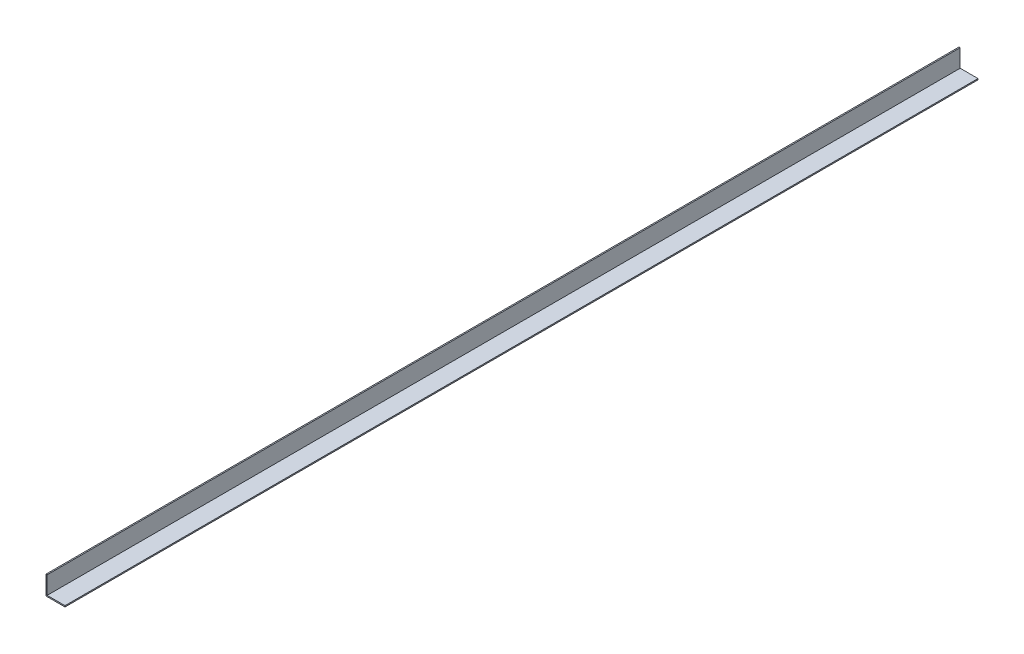
ISO-10303-21;
HEADER;
FILE_DESCRIPTION(('STEP AP214'),'2;1');
FILE_NAME('part.step','',(''),(''),'','','');
FILE_SCHEMA(('AUTOMOTIVE_DESIGN { 1 0 10303 214 1 1 1 1 }'));
ENDSEC;
DATA;
#1=APPLICATION_CONTEXT('core data for automotive mechanical design processes');
#2=APPLICATION_PROTOCOL_DEFINITION('international standard','automotive_design',2000,#1);
#3=PRODUCT_CONTEXT('',#1,'mechanical');
#4=PRODUCT('Part','Part','',(#3));
#5=PRODUCT_RELATED_PRODUCT_CATEGORY('part','',(#4));
#6=PRODUCT_DEFINITION_FORMATION('','',#4);
#7=PRODUCT_DEFINITION_CONTEXT('part definition',#1,'design');
#8=PRODUCT_DEFINITION('design','',#6,#7);
#9=PRODUCT_DEFINITION_SHAPE('','',#8);
#10=(LENGTH_UNIT() NAMED_UNIT(*) SI_UNIT(.MILLI.,.METRE.));
#11=(NAMED_UNIT(*) PLANE_ANGLE_UNIT() SI_UNIT($,.RADIAN.));
#12=(NAMED_UNIT(*) SI_UNIT($,.STERADIAN.) SOLID_ANGLE_UNIT());
#13=UNCERTAINTY_MEASURE_WITH_UNIT(LENGTH_MEASURE(1.E-05),#10,'distance_accuracy_value','');
#14=(GEOMETRIC_REPRESENTATION_CONTEXT(3) GLOBAL_UNCERTAINTY_ASSIGNED_CONTEXT((#13)) GLOBAL_UNIT_ASSIGNED_CONTEXT((#10,
#11,#12)) REPRESENTATION_CONTEXT('',''));
#15=CARTESIAN_POINT('',(0.,0.,0.));
#16=DIRECTION('',(0.,0.,1.));
#17=DIRECTION('',(1.,0.,0.));
#18=AXIS2_PLACEMENT_3D('',#15,#16,#17);
#19=CARTESIAN_POINT('',(7.94,127.,-6100.));
#20=DIRECTION('',(0.,1.,0.));
#21=DIRECTION('',(0.,0.,1.));
#22=AXIS2_PLACEMENT_3D('',#19,#20,#21);
#23=PLANE('',#22);
#24=DIRECTION('',(-1.,0.,0.));
#25=VECTOR('',#24,1.);
#26=CARTESIAN_POINT('',(7.94,127.,0.));
#27=LINE('',#26,#25);
#28=CARTESIAN_POINT('',(7.94,127.,0.));
#29=VERTEX_POINT('',#28);
#30=CARTESIAN_POINT('',(0.,127.,0.));
#31=VERTEX_POINT('',#30);
#32=EDGE_CURVE('E118',#29,#31,#27,.T.);
#33=ORIENTED_EDGE('',*,*,#32,.F.);
#34=DIRECTION('',(0.,0.,1.));
#35=VECTOR('',#34,1.);
#36=CARTESIAN_POINT('',(7.94,127.,-6100.));
#37=LINE('',#36,#35);
#38=CARTESIAN_POINT('',(7.94,127.,-6100.));
#39=VERTEX_POINT('',#38);
#40=EDGE_CURVE('E11',#39,#29,#37,.T.);
#41=ORIENTED_EDGE('',*,*,#40,.F.);
#42=DIRECTION('',(-1.,0.,0.));
#43=VECTOR('',#42,1.);
#44=CARTESIAN_POINT('',(7.94,127.,-6100.));
#45=LINE('',#44,#43);
#46=CARTESIAN_POINT('',(0.,127.,-6100.));
#47=VERTEX_POINT('',#46);
#48=EDGE_CURVE('E132',#39,#47,#45,.T.);
#49=ORIENTED_EDGE('',*,*,#48,.T.);
#50=DIRECTION('',(0.,0.,1.));
#51=VECTOR('',#50,1.);
#52=CARTESIAN_POINT('',(0.,127.,-6100.));
#53=LINE('',#52,#51);
#54=EDGE_CURVE('E36',#47,#31,#53,.T.);
#55=ORIENTED_EDGE('',*,*,#54,.T.);
#56=EDGE_LOOP('',(#33,#41,#49,#55));
#57=FACE_BOUND('',#56,.T.);
#58=ADVANCED_FACE('F33',(#57),#23,.T.);
#59=CARTESIAN_POINT('',(7.94,7.94,-6100.));
#60=DIRECTION('',(1.,0.,0.));
#61=DIRECTION('',(0.,1.,0.));
#62=AXIS2_PLACEMENT_3D('',#59,#60,#61);
#63=PLANE('',#62);
#64=DIRECTION('',(0.,1.,0.));
#65=VECTOR('',#64,1.);
#66=CARTESIAN_POINT('',(7.94,7.94,0.));
#67=LINE('',#66,#65);
#68=CARTESIAN_POINT('',(7.94,7.94,0.));
#69=VERTEX_POINT('',#68);
#70=EDGE_CURVE('E130',#69,#29,#67,.T.);
#71=ORIENTED_EDGE('',*,*,#70,.F.);
#72=DIRECTION('',(0.,0.,1.));
#73=VECTOR('',#72,1.);
#74=CARTESIAN_POINT('',(7.94,7.94,-6100.));
#75=LINE('',#74,#73);
#76=CARTESIAN_POINT('',(7.94,7.94,-6100.));
#77=VERTEX_POINT('',#76);
#78=EDGE_CURVE('E42',#77,#69,#75,.T.);
#79=ORIENTED_EDGE('',*,*,#78,.F.);
#80=DIRECTION('',(0.,1.,0.));
#81=VECTOR('',#80,1.);
#82=CARTESIAN_POINT('',(7.94,7.94,-6100.));
#83=LINE('',#82,#81);
#84=EDGE_CURVE('E108',#77,#39,#83,.T.);
#85=ORIENTED_EDGE('',*,*,#84,.T.);
#86=ORIENTED_EDGE('',*,*,#40,.T.);
#87=EDGE_LOOP('',(#71,#79,#85,#86));
#88=FACE_BOUND('',#87,.T.);
#89=ADVANCED_FACE('F140',(#88),#63,.T.);
#90=CARTESIAN_POINT('',(127.,7.94,-6100.));
#91=DIRECTION('',(0.,1.,0.));
#92=DIRECTION('',(-1.,0.,0.));
#93=AXIS2_PLACEMENT_3D('',#90,#91,#92);
#94=PLANE('',#93);
#95=DIRECTION('',(-1.,0.,0.));
#96=VECTOR('',#95,1.);
#97=CARTESIAN_POINT('',(127.,7.94,0.));
#98=LINE('',#97,#96);
#99=CARTESIAN_POINT('',(127.,7.94,0.));
#100=VERTEX_POINT('',#99);
#101=EDGE_CURVE('E95',#100,#69,#98,.T.);
#102=ORIENTED_EDGE('',*,*,#101,.F.);
#103=DIRECTION('',(0.,0.,1.));
#104=VECTOR('',#103,1.);
#105=CARTESIAN_POINT('',(127.,7.94,-6100.));
#106=LINE('',#105,#104);
#107=CARTESIAN_POINT('',(127.,7.94,-6100.));
#108=VERTEX_POINT('',#107);
#109=EDGE_CURVE('E90',#108,#100,#106,.T.);
#110=ORIENTED_EDGE('',*,*,#109,.F.);
#111=DIRECTION('',(-1.,0.,0.));
#112=VECTOR('',#111,1.);
#113=CARTESIAN_POINT('',(127.,7.94,-6100.));
#114=LINE('',#113,#112);
#115=EDGE_CURVE('E93',#108,#77,#114,.T.);
#116=ORIENTED_EDGE('',*,*,#115,.T.);
#117=ORIENTED_EDGE('',*,*,#78,.T.);
#118=EDGE_LOOP('',(#102,#110,#116,#117));
#119=FACE_BOUND('',#118,.T.);
#120=ADVANCED_FACE('F92',(#119),#94,.T.);
#121=CARTESIAN_POINT('',(127.,0.,-6100.));
#122=DIRECTION('',(1.,0.,0.));
#123=DIRECTION('',(0.,0.,-1.));
#124=AXIS2_PLACEMENT_3D('',#121,#122,#123);
#125=PLANE('',#124);
#126=DIRECTION('',(0.,1.,0.));
#127=VECTOR('',#126,1.);
#128=CARTESIAN_POINT('',(127.,0.,0.));
#129=LINE('',#128,#127);
#130=CARTESIAN_POINT('',(127.,0.,0.));
#131=VERTEX_POINT('',#130);
#132=EDGE_CURVE('E127',#131,#100,#129,.T.);
#133=ORIENTED_EDGE('',*,*,#132,.F.);
#134=DIRECTION('',(0.,0.,1.));
#135=VECTOR('',#134,1.);
#136=CARTESIAN_POINT('',(127.,0.,-6100.));
#137=LINE('',#136,#135);
#138=CARTESIAN_POINT('',(127.,0.,-6100.));
#139=VERTEX_POINT('',#138);
#140=EDGE_CURVE('E100',#139,#131,#137,.T.);
#141=ORIENTED_EDGE('',*,*,#140,.F.);
#142=DIRECTION('',(0.,1.,0.));
#143=VECTOR('',#142,1.);
#144=CARTESIAN_POINT('',(127.,0.,-6100.));
#145=LINE('',#144,#143);
#146=EDGE_CURVE('E106',#139,#108,#145,.T.);
#147=ORIENTED_EDGE('',*,*,#146,.T.);
#148=ORIENTED_EDGE('',*,*,#109,.T.);
#149=EDGE_LOOP('',(#133,#141,#147,#148));
#150=FACE_BOUND('',#149,.T.);
#151=ADVANCED_FACE('F110',(#150),#125,.T.);
#152=CARTESIAN_POINT('',(0.,0.,-6100.));
#153=DIRECTION('',(0.,-1.,0.));
#154=DIRECTION('',(0.,0.,-1.));
#155=AXIS2_PLACEMENT_3D('',#152,#153,#154);
#156=PLANE('',#155);
#157=DIRECTION('',(1.,0.,0.));
#158=VECTOR('',#157,1.);
#159=CARTESIAN_POINT('',(0.,0.,0.));
#160=LINE('',#159,#158);
#161=CARTESIAN_POINT('',(0.,0.,0.));
#162=VERTEX_POINT('',#161);
#163=EDGE_CURVE('E124',#162,#131,#160,.T.);
#164=ORIENTED_EDGE('',*,*,#163,.F.);
#165=DIRECTION('',(0.,0.,1.));
#166=VECTOR('',#165,1.);
#167=CARTESIAN_POINT('',(0.,0.,-6100.));
#168=LINE('',#167,#166);
#169=CARTESIAN_POINT('',(0.,0.,-6100.));
#170=VERTEX_POINT('',#169);
#171=EDGE_CURVE('E135',#170,#162,#168,.T.);
#172=ORIENTED_EDGE('',*,*,#171,.F.);
#173=DIRECTION('',(1.,0.,0.));
#174=VECTOR('',#173,1.);
#175=CARTESIAN_POINT('',(0.,0.,-6100.));
#176=LINE('',#175,#174);
#177=EDGE_CURVE('E111',#170,#139,#176,.T.);
#178=ORIENTED_EDGE('',*,*,#177,.T.);
#179=ORIENTED_EDGE('',*,*,#140,.T.);
#180=EDGE_LOOP('',(#164,#172,#178,#179));
#181=FACE_BOUND('',#180,.T.);
#182=ADVANCED_FACE('F153',(#181),#156,.T.);
#183=CARTESIAN_POINT('',(0.,127.,-6100.));
#184=DIRECTION('',(-1.,0.,0.));
#185=DIRECTION('',(0.,-1.,0.));
#186=AXIS2_PLACEMENT_3D('',#183,#184,#185);
#187=PLANE('',#186);
#188=DIRECTION('',(0.,-1.,0.));
#189=VECTOR('',#188,1.);
#190=CARTESIAN_POINT('',(0.,127.,0.));
#191=LINE('',#190,#189);
#192=EDGE_CURVE('E121',#31,#162,#191,.T.);
#193=ORIENTED_EDGE('',*,*,#192,.F.);
#194=ORIENTED_EDGE('',*,*,#54,.F.);
#195=DIRECTION('',(0.,-1.,0.));
#196=VECTOR('',#195,1.);
#197=CARTESIAN_POINT('',(0.,127.,-6100.));
#198=LINE('',#197,#196);
#199=EDGE_CURVE('E113',#47,#170,#198,.T.);
#200=ORIENTED_EDGE('',*,*,#199,.T.);
#201=ORIENTED_EDGE('',*,*,#171,.T.);
#202=EDGE_LOOP('',(#193,#194,#200,#201));
#203=FACE_BOUND('',#202,.T.);
#204=ADVANCED_FACE('F137',(#203),#187,.T.);
#205=CARTESIAN_POINT('',(0.,0.,-6100.));
#206=DIRECTION('',(0.,0.,1.));
#207=DIRECTION('',(1.,0.,0.));
#208=AXIS2_PLACEMENT_3D('',#205,#206,#207);
#209=PLANE('',#208);
#210=ORIENTED_EDGE('',*,*,#48,.F.);
#211=ORIENTED_EDGE('',*,*,#84,.F.);
#212=ORIENTED_EDGE('',*,*,#115,.F.);
#213=ORIENTED_EDGE('',*,*,#146,.F.);
#214=ORIENTED_EDGE('',*,*,#177,.F.);
#215=ORIENTED_EDGE('',*,*,#199,.F.);
#216=EDGE_LOOP('',(#210,#211,#212,#213,#214,#215));
#217=FACE_BOUND('',#216,.T.);
#218=ADVANCED_FACE('F104',(#217),#209,.F.);
#219=CARTESIAN_POINT('',(0.,0.,0.));
#220=DIRECTION('',(0.,0.,1.));
#221=DIRECTION('',(1.,0.,0.));
#222=AXIS2_PLACEMENT_3D('',#219,#220,#221);
#223=PLANE('',#222);
#224=ORIENTED_EDGE('',*,*,#32,.T.);
#225=ORIENTED_EDGE('',*,*,#192,.T.);
#226=ORIENTED_EDGE('',*,*,#163,.T.);
#227=ORIENTED_EDGE('',*,*,#132,.T.);
#228=ORIENTED_EDGE('',*,*,#101,.T.);
#229=ORIENTED_EDGE('',*,*,#70,.T.);
#230=EDGE_LOOP('',(#224,#225,#226,#227,#228,#229));
#231=FACE_BOUND('',#230,.T.);
#232=ADVANCED_FACE('F139',(#231),#223,.T.);
#233=CLOSED_SHELL('',(#58,#89,#120,#151,#182,#204,#218,#232));
#234=MANIFOLD_SOLID_BREP('B2',#233);
#235=ADVANCED_BREP_SHAPE_REPRESENTATION('',(#18,#234),#14);
#236=SHAPE_DEFINITION_REPRESENTATION(#9,#235);
ENDSEC;
END-ISO-10303-21;
